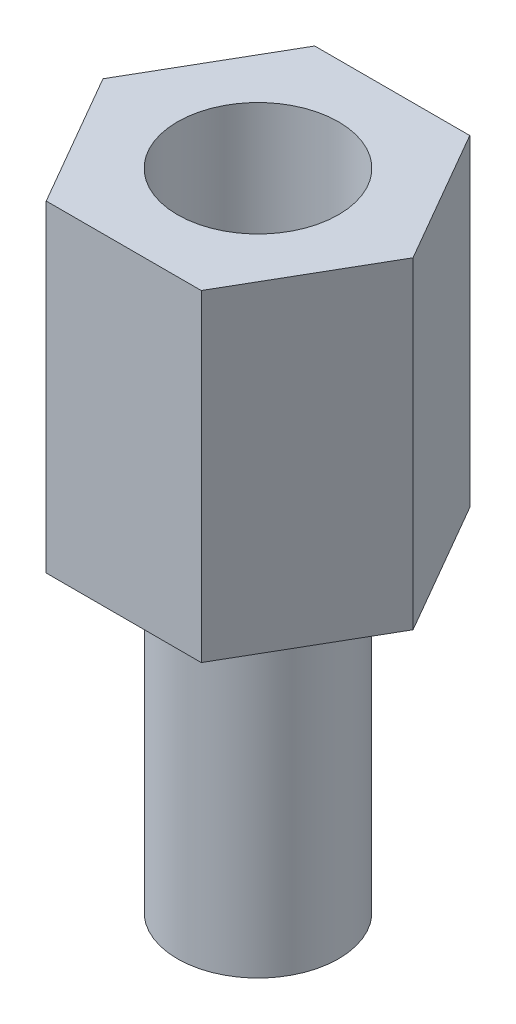
ISO-10303-21;
HEADER;
FILE_DESCRIPTION(('STEP AP214'),'2;1');
FILE_NAME('part.step','',(''),(''),'','','');
FILE_SCHEMA(('AUTOMOTIVE_DESIGN { 1 0 10303 214 1 1 1 1 }'));
ENDSEC;
DATA;
#1=APPLICATION_CONTEXT('core data for automotive mechanical design processes');
#2=APPLICATION_PROTOCOL_DEFINITION('international standard','automotive_design',2000,#1);
#3=PRODUCT_CONTEXT('',#1,'mechanical');
#4=PRODUCT('Part','Part','',(#3));
#5=PRODUCT_RELATED_PRODUCT_CATEGORY('part','',(#4));
#6=PRODUCT_DEFINITION_FORMATION('','',#4);
#7=PRODUCT_DEFINITION_CONTEXT('part definition',#1,'design');
#8=PRODUCT_DEFINITION('design','',#6,#7);
#9=PRODUCT_DEFINITION_SHAPE('','',#8);
#10=(LENGTH_UNIT() NAMED_UNIT(*) SI_UNIT(.MILLI.,.METRE.));
#11=(NAMED_UNIT(*) PLANE_ANGLE_UNIT() SI_UNIT($,.RADIAN.));
#12=(NAMED_UNIT(*) SI_UNIT($,.STERADIAN.) SOLID_ANGLE_UNIT());
#13=UNCERTAINTY_MEASURE_WITH_UNIT(LENGTH_MEASURE(1.E-05),#10,'distance_accuracy_value','');
#14=(GEOMETRIC_REPRESENTATION_CONTEXT(3) GLOBAL_UNCERTAINTY_ASSIGNED_CONTEXT((#13)) GLOBAL_UNIT_ASSIGNED_CONTEXT((#10,
#11,#12)) REPRESENTATION_CONTEXT('',''));
#15=CARTESIAN_POINT('',(0.,0.,0.));
#16=DIRECTION('',(0.,0.,1.));
#17=DIRECTION('',(1.,0.,0.));
#18=AXIS2_PLACEMENT_3D('',#15,#16,#17);
#19=CARTESIAN_POINT('',(0.,-6.,0.));
#20=DIRECTION('',(0.,1.,0.));
#21=DIRECTION('',(0.,0.,1.));
#22=AXIS2_PLACEMENT_3D('',#19,#20,#21);
#23=CYLINDRICAL_SURFACE('',#22,1.5);
#24=CARTESIAN_POINT('',(0.,-6.,0.));
#25=DIRECTION('',(0.,-1.,0.));
#26=DIRECTION('',(0.,0.,-1.));
#27=AXIS2_PLACEMENT_3D('',#24,#25,#26);
#28=CIRCLE('',#27,1.5);
#29=CARTESIAN_POINT('',(0.,-6.,-1.5));
#30=VERTEX_POINT('',#29);
#31=EDGE_CURVE('E11',#30,#30,#28,.T.);
#32=ORIENTED_EDGE('',*,*,#31,.F.);
#33=EDGE_LOOP('',(#32));
#34=FACE_BOUND('',#33,.T.);
#35=CARTESIAN_POINT('',(0.,0.,0.));
#36=DIRECTION('',(0.,-1.,0.));
#37=DIRECTION('',(0.,0.,-1.));
#38=AXIS2_PLACEMENT_3D('',#35,#36,#37);
#39=CIRCLE('',#38,1.5);
#40=CARTESIAN_POINT('',(0.,0.,-1.5));
#41=VERTEX_POINT('',#40);
#42=EDGE_CURVE('E43',#41,#41,#39,.T.);
#43=ORIENTED_EDGE('',*,*,#42,.T.);
#44=EDGE_LOOP('',(#43));
#45=FACE_BOUND('',#44,.T.);
#46=ADVANCED_FACE('F40',(#34,#45),#23,.T.);
#47=CARTESIAN_POINT('',(0.,-6.,0.));
#48=DIRECTION('',(0.,-1.,0.));
#49=DIRECTION('',(0.,0.,-1.));
#50=AXIS2_PLACEMENT_3D('',#47,#48,#49);
#51=PLANE('',#50);
#52=ORIENTED_EDGE('',*,*,#31,.T.);
#53=EDGE_LOOP('',(#52));
#54=FACE_BOUND('',#53,.T.);
#55=ADVANCED_FACE('F55',(#54),#51,.T.);
#56=CARTESIAN_POINT('',(0.,0.,0.));
#57=DIRECTION('',(0.,-1.,0.));
#58=DIRECTION('',(0.,0.,-1.));
#59=AXIS2_PLACEMENT_3D('',#56,#57,#58);
#60=PLANE('',#59);
#61=ORIENTED_EDGE('',*,*,#42,.F.);
#62=EDGE_LOOP('',(#61));
#63=FACE_BOUND('',#62,.T.);
#64=ADVANCED_FACE('F53',(#63),#60,.F.);
#65=CLOSED_SHELL('',(#46,#55,#64));
#66=MANIFOLD_SOLID_BREP('B2',#65);
#67=CARTESIAN_POINT('',(0.,6.,0.));
#68=DIRECTION('',(0.,1.,0.));
#69=DIRECTION('',(0.,0.,1.));
#70=AXIS2_PLACEMENT_3D('',#67,#68,#69);
#71=PLANE('',#70);
#72=DIRECTION('',(1.,0.,0.));
#73=VECTOR('',#72,1.);
#74=CARTESIAN_POINT('',(-1.44337567297405,6.,2.5));
#75=LINE('',#74,#73);
#76=CARTESIAN_POINT('',(-1.44337567297405,6.,2.5));
#77=VERTEX_POINT('',#76);
#78=CARTESIAN_POINT('',(1.44337567297408,6.,2.5));
#79=VERTEX_POINT('',#78);
#80=EDGE_CURVE('E176',#77,#79,#75,.T.);
#81=ORIENTED_EDGE('',*,*,#80,.T.);
#82=DIRECTION('',(0.500000000000001,0.,-0.866025403784438));
#83=VECTOR('',#82,1.);
#84=CARTESIAN_POINT('',(1.44337567297408,6.,2.5));
#85=LINE('',#84,#83);
#86=CARTESIAN_POINT('',(2.88675134594815,6.,0.));
#87=VERTEX_POINT('',#86);
#88=EDGE_CURVE('E134',#79,#87,#85,.T.);
#89=ORIENTED_EDGE('',*,*,#88,.T.);
#90=DIRECTION('',(-0.500000000000001,0.,-0.866025403784438));
#91=VECTOR('',#90,1.);
#92=CARTESIAN_POINT('',(2.88675134594815,6.,0.));
#93=LINE('',#92,#91);
#94=CARTESIAN_POINT('',(1.44337567297408,6.,-2.50000000000001));
#95=VERTEX_POINT('',#94);
#96=EDGE_CURVE('E147',#87,#95,#93,.T.);
#97=ORIENTED_EDGE('',*,*,#96,.T.);
#98=DIRECTION('',(-1.,0.,0.));
#99=VECTOR('',#98,1.);
#100=CARTESIAN_POINT('',(1.44337567297408,6.,-2.50000000000001));
#101=LINE('',#100,#99);
#102=CARTESIAN_POINT('',(-1.44337567297405,6.,-2.50000000000001));
#103=VERTEX_POINT('',#102);
#104=EDGE_CURVE('E141',#95,#103,#101,.T.);
#105=ORIENTED_EDGE('',*,*,#104,.T.);
#106=DIRECTION('',(-0.5,0.,0.866025403784438));
#107=VECTOR('',#106,1.);
#108=CARTESIAN_POINT('',(-1.44337567297405,6.,-2.50000000000001));
#109=LINE('',#108,#107);
#110=CARTESIAN_POINT('',(-2.88675134594812,6.,0.));
#111=VERTEX_POINT('',#110);
#112=EDGE_CURVE('E145',#103,#111,#109,.T.);
#113=ORIENTED_EDGE('',*,*,#112,.T.);
#114=DIRECTION('',(0.5,0.,0.866025403784438));
#115=VECTOR('',#114,1.);
#116=CARTESIAN_POINT('',(-2.88675134594812,6.,0.));
#117=LINE('',#116,#115);
#118=EDGE_CURVE('E97',#111,#77,#117,.T.);
#119=ORIENTED_EDGE('',*,*,#118,.T.);
#120=EDGE_LOOP('',(#81,#89,#97,#105,#113,#119));
#121=FACE_BOUND('',#120,.T.);
#122=CARTESIAN_POINT('',(0.,6.,0.));
#123=DIRECTION('',(0.,1.,0.));
#124=DIRECTION('',(0.,0.,1.));
#125=AXIS2_PLACEMENT_3D('',#122,#123,#124);
#126=CIRCLE('',#125,1.5);
#127=CARTESIAN_POINT('',(0.,6.,1.5));
#128=VERTEX_POINT('',#127);
#129=EDGE_CURVE('E169',#128,#128,#126,.T.);
#130=ORIENTED_EDGE('',*,*,#129,.F.);
#131=EDGE_LOOP('',(#130));
#132=FACE_BOUND('',#131,.T.);
#133=ADVANCED_FACE('F80',(#121,#132),#71,.T.);
#134=CARTESIAN_POINT('',(0.,0.,0.));
#135=DIRECTION('',(0.,1.,0.));
#136=DIRECTION('',(0.,0.,1.));
#137=AXIS2_PLACEMENT_3D('',#134,#135,#136);
#138=PLANE('',#137);
#139=DIRECTION('',(1.,0.,0.));
#140=VECTOR('',#139,1.);
#141=CARTESIAN_POINT('',(-1.44337567297405,0.,2.5));
#142=LINE('',#141,#140);
#143=CARTESIAN_POINT('',(-1.44337567297405,0.,2.5));
#144=VERTEX_POINT('',#143);
#145=CARTESIAN_POINT('',(1.44337567297408,0.,2.5));
#146=VERTEX_POINT('',#145);
#147=EDGE_CURVE('E165',#144,#146,#142,.T.);
#148=ORIENTED_EDGE('',*,*,#147,.F.);
#149=DIRECTION('',(0.5,0.,0.866025403784438));
#150=VECTOR('',#149,1.);
#151=CARTESIAN_POINT('',(-2.88675134594812,0.,0.));
#152=LINE('',#151,#150);
#153=CARTESIAN_POINT('',(-2.88675134594812,0.,0.));
#154=VERTEX_POINT('',#153);
#155=EDGE_CURVE('E126',#154,#144,#152,.T.);
#156=ORIENTED_EDGE('',*,*,#155,.F.);
#157=DIRECTION('',(-0.5,0.,0.866025403784438));
#158=VECTOR('',#157,1.);
#159=CARTESIAN_POINT('',(-1.44337567297405,0.,-2.50000000000001));
#160=LINE('',#159,#158);
#161=CARTESIAN_POINT('',(-1.44337567297405,0.,-2.50000000000001));
#162=VERTEX_POINT('',#161);
#163=EDGE_CURVE('E120',#162,#154,#160,.T.);
#164=ORIENTED_EDGE('',*,*,#163,.F.);
#165=DIRECTION('',(-1.,0.,0.));
#166=VECTOR('',#165,1.);
#167=CARTESIAN_POINT('',(1.44337567297408,0.,-2.50000000000001));
#168=LINE('',#167,#166);
#169=CARTESIAN_POINT('',(1.44337567297408,0.,-2.50000000000001));
#170=VERTEX_POINT('',#169);
#171=EDGE_CURVE('E155',#170,#162,#168,.T.);
#172=ORIENTED_EDGE('',*,*,#171,.F.);
#173=DIRECTION('',(-0.500000000000001,0.,-0.866025403784438));
#174=VECTOR('',#173,1.);
#175=CARTESIAN_POINT('',(2.88675134594815,0.,0.));
#176=LINE('',#175,#174);
#177=CARTESIAN_POINT('',(2.88675134594815,0.,0.));
#178=VERTEX_POINT('',#177);
#179=EDGE_CURVE('E171',#178,#170,#176,.T.);
#180=ORIENTED_EDGE('',*,*,#179,.F.);
#181=DIRECTION('',(0.500000000000001,0.,-0.866025403784438));
#182=VECTOR('',#181,1.);
#183=CARTESIAN_POINT('',(1.44337567297408,0.,2.5));
#184=LINE('',#183,#182);
#185=EDGE_CURVE('E168',#146,#178,#184,.T.);
#186=ORIENTED_EDGE('',*,*,#185,.F.);
#187=EDGE_LOOP('',(#148,#156,#164,#172,#180,#186));
#188=FACE_BOUND('',#187,.T.);
#189=CARTESIAN_POINT('',(0.,0.,0.));
#190=DIRECTION('',(0.,1.,0.));
#191=DIRECTION('',(0.,0.,1.));
#192=AXIS2_PLACEMENT_3D('',#189,#190,#191);
#193=CIRCLE('',#192,1.5);
#194=CARTESIAN_POINT('',(0.,0.,1.5));
#195=VERTEX_POINT('',#194);
#196=EDGE_CURVE('E269',#195,#195,#193,.T.);
#197=ORIENTED_EDGE('',*,*,#196,.T.);
#198=EDGE_LOOP('',(#197));
#199=FACE_BOUND('',#198,.T.);
#200=ADVANCED_FACE('F185',(#188,#199),#138,.F.);
#201=CARTESIAN_POINT('',(-1.44337567297405,6.,2.5));
#202=DIRECTION('',(0.,0.,-1.));
#203=DIRECTION('',(-1.,0.,0.));
#204=AXIS2_PLACEMENT_3D('',#201,#202,#203);
#205=PLANE('',#204);
#206=ORIENTED_EDGE('',*,*,#147,.T.);
#207=DIRECTION('',(0.,-1.,0.));
#208=VECTOR('',#207,1.);
#209=CARTESIAN_POINT('',(1.44337567297408,6.,2.5));
#210=LINE('',#209,#208);
#211=EDGE_CURVE('E38',#79,#146,#210,.T.);
#212=ORIENTED_EDGE('',*,*,#211,.F.);
#213=ORIENTED_EDGE('',*,*,#80,.F.);
#214=DIRECTION('',(0.,-1.,0.));
#215=VECTOR('',#214,1.);
#216=CARTESIAN_POINT('',(-1.44337567297405,6.,2.5));
#217=LINE('',#216,#215);
#218=EDGE_CURVE('E161',#77,#144,#217,.T.);
#219=ORIENTED_EDGE('',*,*,#218,.T.);
#220=EDGE_LOOP('',(#206,#212,#213,#219));
#221=FACE_BOUND('',#220,.T.);
#222=ADVANCED_FACE('F82',(#221),#205,.F.);
#223=CARTESIAN_POINT('',(1.44337567297408,6.,2.5));
#224=DIRECTION('',(-0.866025403784438,0.,-0.500000000000001));
#225=DIRECTION('',(-0.500000000000001,0.,0.866025403784438));
#226=AXIS2_PLACEMENT_3D('',#223,#224,#225);
#227=PLANE('',#226);
#228=ORIENTED_EDGE('',*,*,#185,.T.);
#229=DIRECTION('',(0.,-1.,0.));
#230=VECTOR('',#229,1.);
#231=CARTESIAN_POINT('',(2.88675134594815,6.,0.));
#232=LINE('',#231,#230);
#233=EDGE_CURVE('E89',#87,#178,#232,.T.);
#234=ORIENTED_EDGE('',*,*,#233,.F.);
#235=ORIENTED_EDGE('',*,*,#88,.F.);
#236=ORIENTED_EDGE('',*,*,#211,.T.);
#237=EDGE_LOOP('',(#228,#234,#235,#236));
#238=FACE_BOUND('',#237,.T.);
#239=ADVANCED_FACE('F210',(#238),#227,.F.);
#240=CARTESIAN_POINT('',(2.88675134594815,6.,0.));
#241=DIRECTION('',(-0.866025403784438,0.,0.500000000000001));
#242=DIRECTION('',(0.500000000000001,0.,0.866025403784438));
#243=AXIS2_PLACEMENT_3D('',#240,#241,#242);
#244=PLANE('',#243);
#245=ORIENTED_EDGE('',*,*,#179,.T.);
#246=DIRECTION('',(0.,-1.,0.));
#247=VECTOR('',#246,1.);
#248=CARTESIAN_POINT('',(1.44337567297408,6.,-2.50000000000001));
#249=LINE('',#248,#247);
#250=EDGE_CURVE('E156',#95,#170,#249,.T.);
#251=ORIENTED_EDGE('',*,*,#250,.F.);
#252=ORIENTED_EDGE('',*,*,#96,.F.);
#253=ORIENTED_EDGE('',*,*,#233,.T.);
#254=EDGE_LOOP('',(#245,#251,#252,#253));
#255=FACE_BOUND('',#254,.T.);
#256=ADVANCED_FACE('F182',(#255),#244,.F.);
#257=CARTESIAN_POINT('',(1.44337567297408,6.,-2.50000000000001));
#258=DIRECTION('',(0.,0.,1.));
#259=DIRECTION('',(1.,0.,0.));
#260=AXIS2_PLACEMENT_3D('',#257,#258,#259);
#261=PLANE('',#260);
#262=ORIENTED_EDGE('',*,*,#171,.T.);
#263=DIRECTION('',(0.,-1.,0.));
#264=VECTOR('',#263,1.);
#265=CARTESIAN_POINT('',(-1.44337567297405,6.,-2.50000000000001));
#266=LINE('',#265,#264);
#267=EDGE_CURVE('E152',#103,#162,#266,.T.);
#268=ORIENTED_EDGE('',*,*,#267,.F.);
#269=ORIENTED_EDGE('',*,*,#104,.F.);
#270=ORIENTED_EDGE('',*,*,#250,.T.);
#271=EDGE_LOOP('',(#262,#268,#269,#270));
#272=FACE_BOUND('',#271,.T.);
#273=ADVANCED_FACE('F153',(#272),#261,.F.);
#274=CARTESIAN_POINT('',(-1.44337567297405,6.,-2.50000000000001));
#275=DIRECTION('',(0.866025403784439,0.,0.5));
#276=DIRECTION('',(0.5,0.,-0.866025403784439));
#277=AXIS2_PLACEMENT_3D('',#274,#275,#276);
#278=PLANE('',#277);
#279=ORIENTED_EDGE('',*,*,#163,.T.);
#280=DIRECTION('',(0.,-1.,0.));
#281=VECTOR('',#280,1.);
#282=CARTESIAN_POINT('',(-2.88675134594812,6.,0.));
#283=LINE('',#282,#281);
#284=EDGE_CURVE('E157',#111,#154,#283,.T.);
#285=ORIENTED_EDGE('',*,*,#284,.F.);
#286=ORIENTED_EDGE('',*,*,#112,.F.);
#287=ORIENTED_EDGE('',*,*,#267,.T.);
#288=EDGE_LOOP('',(#279,#285,#286,#287));
#289=FACE_BOUND('',#288,.T.);
#290=ADVANCED_FACE('F159',(#289),#278,.F.);
#291=CARTESIAN_POINT('',(-2.88675134594812,6.,0.));
#292=DIRECTION('',(0.866025403784438,0.,-0.500000000000001));
#293=DIRECTION('',(-0.500000000000001,0.,-0.866025403784438));
#294=AXIS2_PLACEMENT_3D('',#291,#292,#293);
#295=PLANE('',#294);
#296=ORIENTED_EDGE('',*,*,#155,.T.);
#297=ORIENTED_EDGE('',*,*,#218,.F.);
#298=ORIENTED_EDGE('',*,*,#118,.F.);
#299=ORIENTED_EDGE('',*,*,#284,.T.);
#300=EDGE_LOOP('',(#296,#297,#298,#299));
#301=FACE_BOUND('',#300,.T.);
#302=ADVANCED_FACE('F190',(#301),#295,.F.);
#303=CARTESIAN_POINT('',(0.,6.,0.));
#304=DIRECTION('',(0.,-1.,0.));
#305=DIRECTION('',(0.,0.,-1.));
#306=AXIS2_PLACEMENT_3D('',#303,#304,#305);
#307=CYLINDRICAL_SURFACE('',#306,1.5);
#308=ORIENTED_EDGE('',*,*,#129,.T.);
#309=EDGE_LOOP('',(#308));
#310=FACE_BOUND('',#309,.T.);
#311=ORIENTED_EDGE('',*,*,#196,.F.);
#312=EDGE_LOOP('',(#311));
#313=FACE_BOUND('',#312,.T.);
#314=ADVANCED_FACE('F192',(#310,#313),#307,.F.);
#315=CLOSED_SHELL('',(#133,#200,#222,#239,#256,#273,#290,#302,#314));
#316=MANIFOLD_SOLID_BREP('B6',#315);
#317=ADVANCED_BREP_SHAPE_REPRESENTATION('',(#18,#66,#316),#14);
#318=SHAPE_DEFINITION_REPRESENTATION(#9,#317);
ENDSEC;
END-ISO-10303-21;
